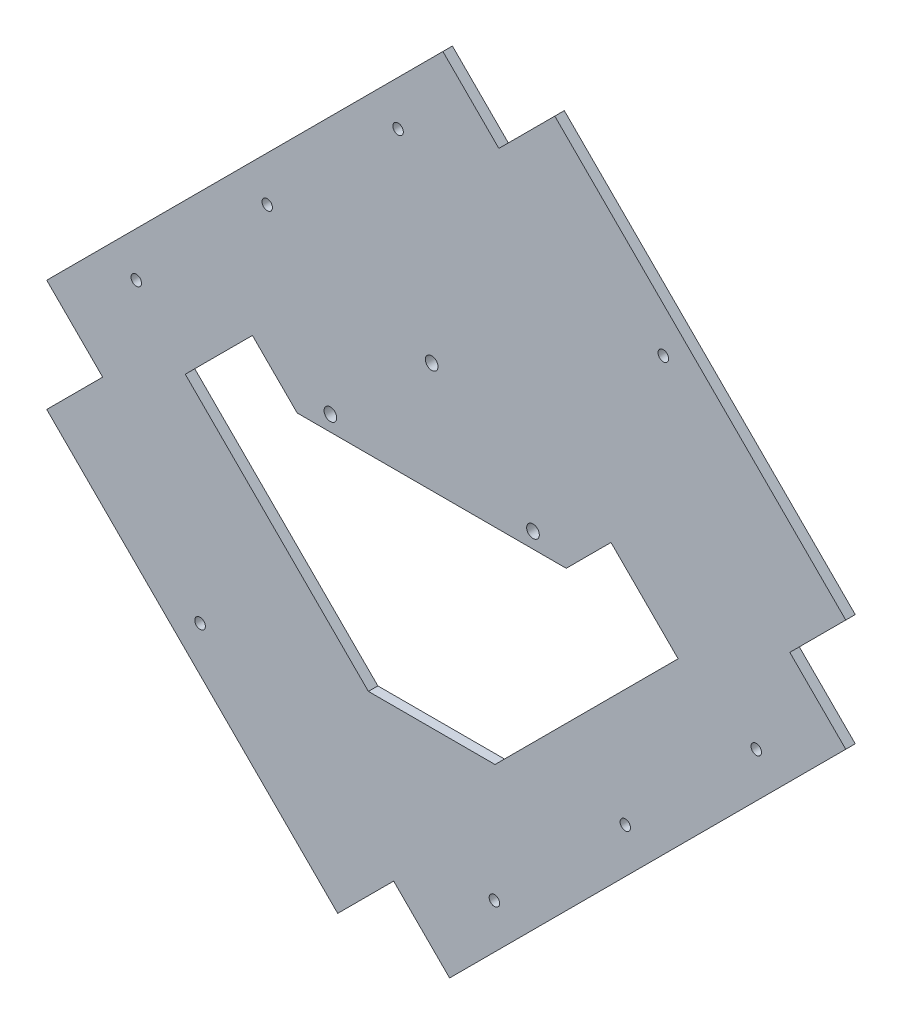
ISO-10303-21;
HEADER;
FILE_DESCRIPTION(('STEP AP214'),'2;1');
FILE_NAME('part.step','',(''),(''),'','','');
FILE_SCHEMA(('AUTOMOTIVE_DESIGN { 1 0 10303 214 1 1 1 1 }'));
ENDSEC;
DATA;
#1=APPLICATION_CONTEXT('core data for automotive mechanical design processes');
#2=APPLICATION_PROTOCOL_DEFINITION('international standard','automotive_design',2000,#1);
#3=PRODUCT_CONTEXT('',#1,'mechanical');
#4=PRODUCT('Part','Part','',(#3));
#5=PRODUCT_RELATED_PRODUCT_CATEGORY('part','',(#4));
#6=PRODUCT_DEFINITION_FORMATION('','',#4);
#7=PRODUCT_DEFINITION_CONTEXT('part definition',#1,'design');
#8=PRODUCT_DEFINITION('design','',#6,#7);
#9=PRODUCT_DEFINITION_SHAPE('','',#8);
#10=(LENGTH_UNIT() NAMED_UNIT(*) SI_UNIT(.MILLI.,.METRE.));
#11=(NAMED_UNIT(*) PLANE_ANGLE_UNIT() SI_UNIT($,.RADIAN.));
#12=(NAMED_UNIT(*) SI_UNIT($,.STERADIAN.) SOLID_ANGLE_UNIT());
#13=UNCERTAINTY_MEASURE_WITH_UNIT(LENGTH_MEASURE(1.E-05),#10,'distance_accuracy_value','');
#14=(GEOMETRIC_REPRESENTATION_CONTEXT(3) GLOBAL_UNCERTAINTY_ASSIGNED_CONTEXT((#13)) GLOBAL_UNIT_ASSIGNED_CONTEXT((#10,
#11,#12)) REPRESENTATION_CONTEXT('',''));
#15=CARTESIAN_POINT('',(0.,0.,0.));
#16=DIRECTION('',(0.,0.,1.));
#17=DIRECTION('',(1.,0.,0.));
#18=AXIS2_PLACEMENT_3D('',#15,#16,#17);
#19=CARTESIAN_POINT('',(-160.51323932996,65.2264068714516,-7.));
#20=DIRECTION('',(0.707106781186548,0.707106781186547,0.));
#21=DIRECTION('',(-0.707106781186547,0.707106781186548,0.));
#22=AXIS2_PLACEMENT_3D('',#19,#20,#21);
#23=PLANE('',#22);
#24=DIRECTION('',(0.707106781186547,-0.707106781186548,0.));
#25=VECTOR('',#24,1.);
#26=CARTESIAN_POINT('',(-47.6434162292543,-47.6434162292543,0.));
#27=LINE('',#26,#25);
#28=CARTESIAN_POINT('',(-121.6223663647,26.3355339061915,0.));
#29=VERTEX_POINT('',#28);
#30=CARTESIAN_POINT('',(-29.6984848104488,-65.5883476480598,0.));
#31=VERTEX_POINT('',#30);
#32=EDGE_CURVE('E328',#29,#31,#27,.T.);
#33=ORIENTED_EDGE('',*,*,#32,.T.);
#34=DIRECTION('',(0.,0.,-1.));
#35=VECTOR('',#34,1.);
#36=CARTESIAN_POINT('',(-29.6984848104488,-65.5883476480598,3.));
#37=LINE('',#36,#35);
#38=CARTESIAN_POINT('',(-29.6984848104488,-65.5883476480598,3.));
#39=VERTEX_POINT('',#38);
#40=EDGE_CURVE('E273',#39,#31,#37,.T.);
#41=ORIENTED_EDGE('',*,*,#40,.F.);
#42=DIRECTION('',(-0.707106781186547,0.707106781186548,0.));
#43=VECTOR('',#42,1.);
#44=CARTESIAN_POINT('',(-160.51323932996,65.2264068714516,3.));
#45=LINE('',#44,#43);
#46=CARTESIAN_POINT('',(-121.6223663647,26.3355339061915,3.));
#47=VERTEX_POINT('',#46);
#48=EDGE_CURVE('E325',#39,#47,#45,.T.);
#49=ORIENTED_EDGE('',*,*,#48,.T.);
#50=DIRECTION('',(0.,0.,-1.));
#51=VECTOR('',#50,1.);
#52=CARTESIAN_POINT('',(-121.6223663647,26.3355339061915,3.));
#53=LINE('',#52,#51);
#54=EDGE_CURVE('E304',#47,#29,#53,.T.);
#55=ORIENTED_EDGE('',*,*,#54,.T.);
#56=EDGE_LOOP('',(#33,#41,#49,#55));
#57=FACE_BOUND('',#56,.T.);
#58=ADVANCED_FACE('F82',(#57),#23,.F.);
#59=CARTESIAN_POINT('',(160.513239328732,65.2264068714516,-362.175614304609));
#60=DIRECTION('',(0.707106781186547,0.707106781186547,0.));
#61=DIRECTION('',(-0.707106781186548,0.707106781186548,0.));
#62=AXIS2_PLACEMENT_3D('',#59,#60,#61);
#63=PLANE('',#62);
#64=DIRECTION('',(-0.707106781186547,0.707106781186548,0.));
#65=VECTOR('',#64,1.);
#66=CARTESIAN_POINT('',(160.513239328732,65.2264068714516,3.));
#67=LINE('',#66,#65);
#68=CARTESIAN_POINT('',(130.814754518897,94.9248916812865,3.));
#69=VERTEX_POINT('',#68);
#70=CARTESIAN_POINT('',(38.8908729646462,186.848773235538,3.));
#71=VERTEX_POINT('',#70);
#72=EDGE_CURVE('E320',#69,#71,#67,.T.);
#73=ORIENTED_EDGE('',*,*,#72,.F.);
#74=DIRECTION('',(0.,0.,-1.));
#75=VECTOR('',#74,1.);
#76=CARTESIAN_POINT('',(130.814754518897,94.9248916812865,3.));
#77=LINE('',#76,#75);
#78=CARTESIAN_POINT('',(130.814754518897,94.9248916812865,0.));
#79=VERTEX_POINT('',#78);
#80=EDGE_CURVE('E224',#69,#79,#77,.T.);
#81=ORIENTED_EDGE('',*,*,#80,.T.);
#82=DIRECTION('',(-0.707106781186548,0.707106781186548,0.));
#83=VECTOR('',#82,1.);
#84=CARTESIAN_POINT('',(160.513239328732,65.2264068714516,0.));
#85=LINE('',#84,#83);
#86=CARTESIAN_POINT('',(38.8908729646462,186.848773235538,0.));
#87=VERTEX_POINT('',#86);
#88=EDGE_CURVE('E322',#79,#87,#85,.T.);
#89=ORIENTED_EDGE('',*,*,#88,.T.);
#90=DIRECTION('',(0.,0.,-1.));
#91=VECTOR('',#90,1.);
#92=CARTESIAN_POINT('',(38.8908729646462,186.848773235538,3.));
#93=LINE('',#92,#91);
#94=EDGE_CURVE('E301',#71,#87,#93,.T.);
#95=ORIENTED_EDGE('',*,*,#94,.F.);
#96=EDGE_LOOP('',(#73,#81,#89,#95));
#97=FACE_BOUND('',#96,.T.);
#98=ADVANCED_FACE('F441',(#97),#63,.T.);
#99=CARTESIAN_POINT('',(0.,0.,3.));
#100=DIRECTION('',(0.,0.,-1.));
#101=DIRECTION('',(-1.,0.,0.));
#102=AXIS2_PLACEMENT_3D('',#99,#100,#101);
#103=PLANE('',#102);
#104=CARTESIAN_POINT('',(-10.6066017184122,158.564501988076,3.));
#105=DIRECTION('',(0.,0.,-1.));
#106=DIRECTION('',(-1.,0.,0.));
#107=AXIS2_PLACEMENT_3D('',#104,#105,#106);
#108=CIRCLE('',#107,1.65000000000001);
#109=CARTESIAN_POINT('',(-12.2566017184123,158.564501988076,3.));
#110=VERTEX_POINT('',#109);
#111=EDGE_CURVE('E251',#110,#110,#108,.T.);
#112=ORIENTED_EDGE('',*,*,#111,.T.);
#113=EDGE_LOOP('',(#112));
#114=FACE_BOUND('',#113,.T.);
#115=CARTESIAN_POINT('',(-51.9723484178253,117.198755288663,3.));
#116=DIRECTION('',(0.,0.,-1.));
#117=DIRECTION('',(-1.,0.,0.));
#118=AXIS2_PLACEMENT_3D('',#115,#116,#117);
#119=CIRCLE('',#118,1.65);
#120=CARTESIAN_POINT('',(-53.6223484178253,117.198755288663,3.));
#121=VERTEX_POINT('',#120);
#122=EDGE_CURVE('E518',#121,#121,#119,.T.);
#123=ORIENTED_EDGE('',*,*,#122,.T.);
#124=EDGE_LOOP('',(#123));
#125=FACE_BOUND('',#124,.T.);
#126=CARTESIAN_POINT('',(-93.3380951172383,75.8330085892499,3.));
#127=DIRECTION('',(0.,0.,-1.));
#128=DIRECTION('',(-1.,0.,0.));
#129=AXIS2_PLACEMENT_3D('',#126,#127,#128);
#130=CIRCLE('',#129,1.65);
#131=CARTESIAN_POINT('',(-94.9880951172383,75.8330085892499,3.));
#132=VERTEX_POINT('',#131);
#133=EDGE_CURVE('E520',#132,#132,#130,.T.);
#134=ORIENTED_EDGE('',*,*,#133,.T.);
#135=EDGE_LOOP('',(#134));
#136=FACE_BOUND('',#135,.T.);
#137=CARTESIAN_POINT('',(102.530483271436,45.4274169982283,3.));
#138=DIRECTION('',(0.,0.,-1.));
#139=DIRECTION('',(-1.,0.,0.));
#140=AXIS2_PLACEMENT_3D('',#137,#138,#139);
#141=CIRCLE('',#140,1.65);
#142=CARTESIAN_POINT('',(100.880483271436,45.4274169982283,3.));
#143=VERTEX_POINT('',#142);
#144=EDGE_CURVE('E524',#143,#143,#141,.T.);
#145=ORIENTED_EDGE('',*,*,#144,.T.);
#146=EDGE_LOOP('',(#145));
#147=FACE_BOUND('',#146,.T.);
#148=CARTESIAN_POINT('',(61.1647365720224,4.06167029881523,3.));
#149=DIRECTION('',(0.,0.,-1.));
#150=DIRECTION('',(-1.,0.,0.));
#151=AXIS2_PLACEMENT_3D('',#148,#149,#150);
#152=CIRCLE('',#151,1.65);
#153=CARTESIAN_POINT('',(59.5147365720224,4.06167029881523,3.));
#154=VERTEX_POINT('',#153);
#155=EDGE_CURVE('E529',#154,#154,#152,.T.);
#156=ORIENTED_EDGE('',*,*,#155,.T.);
#157=EDGE_LOOP('',(#156));
#158=FACE_BOUND('',#157,.T.);
#159=CARTESIAN_POINT('',(19.7989898726094,-37.3040764005978,3.));
#160=DIRECTION('',(0.,0.,-1.));
#161=DIRECTION('',(-1.,0.,0.));
#162=AXIS2_PLACEMENT_3D('',#159,#160,#161);
#163=CIRCLE('',#162,1.65);
#164=CARTESIAN_POINT('',(18.1489898726094,-37.3040764005978,3.));
#165=VERTEX_POINT('',#164);
#166=EDGE_CURVE('E532',#165,#165,#163,.T.);
#167=ORIENTED_EDGE('',*,*,#166,.T.);
#168=EDGE_LOOP('',(#167));
#169=FACE_BOUND('',#168,.T.);
#170=CARTESIAN_POINT('',(73.1855518521937,138.411958724259,3.));
#171=DIRECTION('',(0.,0.,1.));
#172=DIRECTION('',(1.,0.,0.));
#173=AXIS2_PLACEMENT_3D('',#170,#171,#172);
#174=CIRCLE('',#173,1.675);
#175=CARTESIAN_POINT('',(74.8605518521937,138.411958724259,3.));
#176=VERTEX_POINT('',#175);
#177=EDGE_CURVE('E314',#176,#176,#174,.T.);
#178=ORIENTED_EDGE('',*,*,#177,.F.);
#179=EDGE_LOOP('',(#178));
#180=FACE_BOUND('',#179,.T.);
#181=CARTESIAN_POINT('',(-73.1855518534216,-7.95914498135607,3.));
#182=DIRECTION('',(0.,0.,1.));
#183=DIRECTION('',(1.,0.,0.));
#184=AXIS2_PLACEMENT_3D('',#181,#182,#183);
#185=CIRCLE('',#184,1.675);
#186=CARTESIAN_POINT('',(-71.5105518534216,-7.95914498135607,3.));
#187=VERTEX_POINT('',#186);
#188=EDGE_CURVE('E303',#187,#187,#185,.T.);
#189=ORIENTED_EDGE('',*,*,#188,.F.);
#190=EDGE_LOOP('',(#189));
#191=FACE_BOUND('',#190,.T.);
#192=ORIENTED_EDGE('',*,*,#48,.F.);
#193=DIRECTION('',(0.707106781186548,0.707106781186548,0.));
#194=VECTOR('',#193,1.);
#195=CARTESIAN_POINT('',(17.9449314188055,-17.9449314188055,3.));
#196=LINE('',#195,#194);
#197=CARTESIAN_POINT('',(-12.0208152807852,-47.9106781183961,3.));
#198=VERTEX_POINT('',#197);
#199=EDGE_CURVE('E229',#39,#198,#196,.T.);
#200=ORIENTED_EDGE('',*,*,#199,.T.);
#201=DIRECTION('',(0.707106781186549,-0.707106781186546,0.));
#202=VECTOR('',#201,1.);
#203=CARTESIAN_POINT('',(-29.9657466995906,-29.9657466995907,3.));
#204=LINE('',#203,#202);
#205=CARTESIAN_POINT('',(5.65685424887843,-65.5883476480597,3.));
#206=VERTEX_POINT('',#205);
#207=EDGE_CURVE('E256',#198,#206,#204,.T.);
#208=ORIENTED_EDGE('',*,*,#207,.T.);
#209=DIRECTION('',(-0.707106781186548,-0.707106781186547,0.));
#210=VECTOR('',#209,1.);
#211=CARTESIAN_POINT('',(35.622600948469,-35.6226009484691,3.));
#212=LINE('',#211,#210);
#213=CARTESIAN_POINT('',(130.814754518897,59.5695526219592,3.));
#214=VERTEX_POINT('',#213);
#215=EDGE_CURVE('E238',#214,#206,#212,.T.);
#216=ORIENTED_EDGE('',*,*,#215,.F.);
#217=DIRECTION('',(0.707106781186547,-0.707106781186548,0.));
#218=VECTOR('',#217,1.);
#219=CARTESIAN_POINT('',(95.1921535704283,95.1921535704282,3.));
#220=LINE('',#219,#218);
#221=CARTESIAN_POINT('',(113.137084989234,77.2472221516229,3.));
#222=VERTEX_POINT('',#221);
#223=EDGE_CURVE('E230',#222,#214,#220,.T.);
#224=ORIENTED_EDGE('',*,*,#223,.F.);
#225=DIRECTION('',(-0.707106781186548,-0.707106781186548,0.));
#226=VECTOR('',#225,1.);
#227=CARTESIAN_POINT('',(17.9449314188054,-17.9449314188054,3.));
#228=LINE('',#227,#226);
#229=EDGE_CURVE('E219',#69,#222,#228,.T.);
#230=ORIENTED_EDGE('',*,*,#229,.F.);
#231=ORIENTED_EDGE('',*,*,#72,.T.);
#232=DIRECTION('',(-0.70710678118655,-0.707106781186545,0.));
#233=VECTOR('',#232,1.);
#234=CARTESIAN_POINT('',(-73.9789501354459,73.9789501354464,3.));
#235=LINE('',#234,#233);
#236=CARTESIAN_POINT('',(21.2132034349825,169.171103705874,3.));
#237=VERTEX_POINT('',#236);
#238=EDGE_CURVE('E99',#71,#237,#235,.T.);
#239=ORIENTED_EDGE('',*,*,#238,.T.);
#240=DIRECTION('',(-0.707106781186548,0.707106781186548,0.));
#241=VECTOR('',#240,1.);
#242=CARTESIAN_POINT('',(95.1921535704283,95.1921535704283,3.));
#243=LINE('',#242,#241);
#244=CARTESIAN_POINT('',(3.53553390531877,186.848773235538,3.));
#245=VERTEX_POINT('',#244);
#246=EDGE_CURVE('E277',#237,#245,#243,.T.);
#247=ORIENTED_EDGE('',*,*,#246,.T.);
#248=DIRECTION('',(0.707106781186548,0.707106781186547,0.));
#249=VECTOR('',#248,1.);
#250=CARTESIAN_POINT('',(-91.6566196651095,91.6566196651096,3.));
#251=LINE('',#250,#249);
#252=CARTESIAN_POINT('',(-121.6223663647,61.690872965519,3.));
#253=VERTEX_POINT('',#252);
#254=EDGE_CURVE('E281',#253,#245,#251,.T.);
#255=ORIENTED_EDGE('',*,*,#254,.F.);
#256=DIRECTION('',(-0.707106781186547,0.707106781186548,0.));
#257=VECTOR('',#256,1.);
#258=CARTESIAN_POINT('',(-29.9657466995906,-29.9657466995906,3.));
#259=LINE('',#258,#257);
#260=CARTESIAN_POINT('',(-103.944696835036,44.0132034358552,3.));
#261=VERTEX_POINT('',#260);
#262=EDGE_CURVE('E283',#261,#253,#259,.T.);
#263=ORIENTED_EDGE('',*,*,#262,.F.);
#264=DIRECTION('',(0.707106781186546,0.707106781186549,0.));
#265=VECTOR('',#264,1.);
#266=CARTESIAN_POINT('',(-73.978950135446,73.9789501354456,3.));
#267=LINE('',#266,#265);
#268=EDGE_CURVE('E285',#47,#261,#267,.T.);
#269=ORIENTED_EDGE('',*,*,#268,.F.);
#270=EDGE_LOOP('',(#192,#200,#208,#216,#224,#230,#231,#239,#247,#255,#263,#269));
#271=FACE_BOUND('',#270,.T.);
#272=DIRECTION('',(0.707106781186548,-0.707106781186547,0.));
#273=VECTOR('',#272,1.);
#274=CARTESIAN_POINT('',(-77.8553390593274,57.8553390593274,3.));
#275=LINE('',#274,#273);
#276=CARTESIAN_POINT('',(-77.8553390593274,57.8553390593274,3.));
#277=VERTEX_POINT('',#276);
#278=CARTESIAN_POINT('',(-20.,0.,3.));
#279=VERTEX_POINT('',#278);
#280=EDGE_CURVE('E350',#277,#279,#275,.T.);
#281=ORIENTED_EDGE('',*,*,#280,.F.);
#282=DIRECTION('',(-0.707106781186547,-0.707106781186548,0.));
#283=VECTOR('',#282,1.);
#284=CARTESIAN_POINT('',(-56.642135623731,79.0685424949238,3.));
#285=LINE('',#284,#283);
#286=CARTESIAN_POINT('',(-56.642135623731,79.0685424949238,3.));
#287=VERTEX_POINT('',#286);
#288=EDGE_CURVE('E366',#287,#277,#285,.T.);
#289=ORIENTED_EDGE('',*,*,#288,.F.);
#290=DIRECTION('',(-0.707106781186548,0.707106781186547,0.));
#291=VECTOR('',#290,1.);
#292=CARTESIAN_POINT('',(-42.5,64.9264068711928,3.));
#293=LINE('',#292,#291);
#294=CARTESIAN_POINT('',(-42.5,64.9264068711928,3.));
#295=VERTEX_POINT('',#294);
#296=EDGE_CURVE('E363',#295,#287,#293,.T.);
#297=ORIENTED_EDGE('',*,*,#296,.F.);
#298=DIRECTION('',(-1.,0.,0.));
#299=VECTOR('',#298,1.);
#300=CARTESIAN_POINT('',(42.5,64.9264068711929,3.));
#301=LINE('',#300,#299);
#302=CARTESIAN_POINT('',(42.5,64.9264068711929,3.));
#303=VERTEX_POINT('',#302);
#304=EDGE_CURVE('E361',#303,#295,#301,.T.);
#305=ORIENTED_EDGE('',*,*,#304,.F.);
#306=DIRECTION('',(-0.707106781186548,-0.707106781186547,0.));
#307=VECTOR('',#306,1.);
#308=CARTESIAN_POINT('',(56.642135623731,79.0685424949238,3.));
#309=LINE('',#308,#307);
#310=CARTESIAN_POINT('',(56.642135623731,79.0685424949238,3.));
#311=VERTEX_POINT('',#310);
#312=EDGE_CURVE('E359',#311,#303,#309,.T.);
#313=ORIENTED_EDGE('',*,*,#312,.F.);
#314=DIRECTION('',(-0.707106781186547,0.707106781186548,0.));
#315=VECTOR('',#314,1.);
#316=CARTESIAN_POINT('',(77.8553390593274,57.8553390593274,3.));
#317=LINE('',#316,#315);
#318=CARTESIAN_POINT('',(77.8553390593274,57.8553390593274,3.));
#319=VERTEX_POINT('',#318);
#320=EDGE_CURVE('E357',#319,#311,#317,.T.);
#321=ORIENTED_EDGE('',*,*,#320,.F.);
#322=DIRECTION('',(0.707106781186547,0.707106781186548,0.));
#323=VECTOR('',#322,1.);
#324=CARTESIAN_POINT('',(20.,0.,3.));
#325=LINE('',#324,#323);
#326=CARTESIAN_POINT('',(20.,0.,3.));
#327=VERTEX_POINT('',#326);
#328=EDGE_CURVE('E355',#327,#319,#325,.T.);
#329=ORIENTED_EDGE('',*,*,#328,.F.);
#330=DIRECTION('',(1.,0.,0.));
#331=VECTOR('',#330,1.);
#332=CARTESIAN_POINT('',(-20.,0.,3.));
#333=LINE('',#332,#331);
#334=EDGE_CURVE('E352',#279,#327,#333,.T.);
#335=ORIENTED_EDGE('',*,*,#334,.F.);
#336=EDGE_LOOP('',(#281,#289,#297,#305,#313,#321,#329,#335));
#337=FACE_BOUND('',#336,.T.);
#338=CARTESIAN_POINT('',(32.,69.8264068711928,3.));
#339=DIRECTION('',(0.,0.,1.));
#340=DIRECTION('',(1.,0.,0.));
#341=AXIS2_PLACEMENT_3D('',#338,#339,#340);
#342=CIRCLE('',#341,2.);
#343=CARTESIAN_POINT('',(34.,69.8264068711928,3.));
#344=VERTEX_POINT('',#343);
#345=EDGE_CURVE('E344',#344,#344,#342,.T.);
#346=ORIENTED_EDGE('',*,*,#345,.F.);
#347=EDGE_LOOP('',(#346));
#348=FACE_BOUND('',#347,.T.);
#349=CARTESIAN_POINT('',(-32.,69.8264068711928,3.));
#350=DIRECTION('',(0.,0.,1.));
#351=DIRECTION('',(1.,0.,0.));
#352=AXIS2_PLACEMENT_3D('',#349,#350,#351);
#353=CIRCLE('',#352,2.);
#354=CARTESIAN_POINT('',(-30.,69.8264068711928,3.));
#355=VERTEX_POINT('',#354);
#356=EDGE_CURVE('E338',#355,#355,#353,.T.);
#357=ORIENTED_EDGE('',*,*,#356,.F.);
#358=EDGE_LOOP('',(#357));
#359=FACE_BOUND('',#358,.T.);
#360=CARTESIAN_POINT('',(0.,99.8264068711928,3.));
#361=DIRECTION('',(0.,0.,1.));
#362=DIRECTION('',(1.,0.,0.));
#363=AXIS2_PLACEMENT_3D('',#360,#361,#362);
#364=CIRCLE('',#363,2.);
#365=CARTESIAN_POINT('',(2.,99.8264068711928,3.));
#366=VERTEX_POINT('',#365);
#367=EDGE_CURVE('E332',#366,#366,#364,.T.);
#368=ORIENTED_EDGE('',*,*,#367,.F.);
#369=EDGE_LOOP('',(#368));
#370=FACE_BOUND('',#369,.T.);
#371=ADVANCED_FACE('F242',(#114,#125,#136,#147,#158,#169,#180,#191,#271,#337,#348,#359,#370),
#103,.F.);
#372=CARTESIAN_POINT('',(0.,0.,0.));
#373=DIRECTION('',(0.,0.,-1.));
#374=DIRECTION('',(-1.,0.,0.));
#375=AXIS2_PLACEMENT_3D('',#372,#373,#374);
#376=PLANE('',#375);
#377=CARTESIAN_POINT('',(-10.6066017184122,158.564501988076,0.));
#378=DIRECTION('',(0.,0.,-1.));
#379=DIRECTION('',(-1.,0.,0.));
#380=AXIS2_PLACEMENT_3D('',#377,#378,#379);
#381=CIRCLE('',#380,1.65000000000001);
#382=CARTESIAN_POINT('',(-12.2566017184123,158.564501988076,0.));
#383=VERTEX_POINT('',#382);
#384=EDGE_CURVE('E514',#383,#383,#381,.T.);
#385=ORIENTED_EDGE('',*,*,#384,.F.);
#386=EDGE_LOOP('',(#385));
#387=FACE_BOUND('',#386,.T.);
#388=CARTESIAN_POINT('',(-51.9723484178253,117.198755288663,0.));
#389=DIRECTION('',(0.,0.,-1.));
#390=DIRECTION('',(-1.,0.,0.));
#391=AXIS2_PLACEMENT_3D('',#388,#389,#390);
#392=CIRCLE('',#391,1.65);
#393=CARTESIAN_POINT('',(-53.6223484178253,117.198755288663,0.));
#394=VERTEX_POINT('',#393);
#395=EDGE_CURVE('E547',#394,#394,#392,.T.);
#396=ORIENTED_EDGE('',*,*,#395,.F.);
#397=EDGE_LOOP('',(#396));
#398=FACE_BOUND('',#397,.T.);
#399=CARTESIAN_POINT('',(-93.3380951172383,75.8330085892499,0.));
#400=DIRECTION('',(0.,0.,-1.));
#401=DIRECTION('',(-1.,0.,0.));
#402=AXIS2_PLACEMENT_3D('',#399,#400,#401);
#403=CIRCLE('',#402,1.65);
#404=CARTESIAN_POINT('',(-94.9880951172383,75.8330085892499,0.));
#405=VERTEX_POINT('',#404);
#406=EDGE_CURVE('E544',#405,#405,#403,.T.);
#407=ORIENTED_EDGE('',*,*,#406,.F.);
#408=EDGE_LOOP('',(#407));
#409=FACE_BOUND('',#408,.T.);
#410=CARTESIAN_POINT('',(102.530483271436,45.4274169982283,0.));
#411=DIRECTION('',(0.,0.,-1.));
#412=DIRECTION('',(-1.,0.,0.));
#413=AXIS2_PLACEMENT_3D('',#410,#411,#412);
#414=CIRCLE('',#413,1.65);
#415=CARTESIAN_POINT('',(100.880483271436,45.4274169982283,0.));
#416=VERTEX_POINT('',#415);
#417=EDGE_CURVE('E541',#416,#416,#414,.T.);
#418=ORIENTED_EDGE('',*,*,#417,.F.);
#419=EDGE_LOOP('',(#418));
#420=FACE_BOUND('',#419,.T.);
#421=CARTESIAN_POINT('',(61.1647365720224,4.06167029881523,0.));
#422=DIRECTION('',(0.,0.,-1.));
#423=DIRECTION('',(-1.,0.,0.));
#424=AXIS2_PLACEMENT_3D('',#421,#422,#423);
#425=CIRCLE('',#424,1.65);
#426=CARTESIAN_POINT('',(59.5147365720224,4.06167029881523,0.));
#427=VERTEX_POINT('',#426);
#428=EDGE_CURVE('E538',#427,#427,#425,.T.);
#429=ORIENTED_EDGE('',*,*,#428,.F.);
#430=EDGE_LOOP('',(#429));
#431=FACE_BOUND('',#430,.T.);
#432=CARTESIAN_POINT('',(19.7989898726094,-37.3040764005978,0.));
#433=DIRECTION('',(0.,0.,-1.));
#434=DIRECTION('',(-1.,0.,0.));
#435=AXIS2_PLACEMENT_3D('',#432,#433,#434);
#436=CIRCLE('',#435,1.65);
#437=CARTESIAN_POINT('',(18.1489898726094,-37.3040764005978,0.));
#438=VERTEX_POINT('',#437);
#439=EDGE_CURVE('E535',#438,#438,#436,.T.);
#440=ORIENTED_EDGE('',*,*,#439,.F.);
#441=EDGE_LOOP('',(#440));
#442=FACE_BOUND('',#441,.T.);
#443=DIRECTION('',(0.707106781186548,0.707106781186548,0.));
#444=VECTOR('',#443,1.);
#445=CARTESIAN_POINT('',(17.9449314188055,-17.9449314188055,0.));
#446=LINE('',#445,#444);
#447=CARTESIAN_POINT('',(-12.0208152807852,-47.9106781183961,0.));
#448=VERTEX_POINT('',#447);
#449=EDGE_CURVE('E261',#31,#448,#446,.T.);
#450=ORIENTED_EDGE('',*,*,#449,.F.);
#451=ORIENTED_EDGE('',*,*,#32,.F.);
#452=DIRECTION('',(0.707106781186546,0.707106781186549,0.));
#453=VECTOR('',#452,1.);
#454=CARTESIAN_POINT('',(-73.978950135446,73.9789501354456,0.));
#455=LINE('',#454,#453);
#456=CARTESIAN_POINT('',(-103.944696835036,44.0132034358552,0.));
#457=VERTEX_POINT('',#456);
#458=EDGE_CURVE('E278',#29,#457,#455,.T.);
#459=ORIENTED_EDGE('',*,*,#458,.T.);
#460=DIRECTION('',(-0.707106781186547,0.707106781186548,0.));
#461=VECTOR('',#460,1.);
#462=CARTESIAN_POINT('',(-29.9657466995906,-29.9657466995906,0.));
#463=LINE('',#462,#461);
#464=CARTESIAN_POINT('',(-121.6223663647,61.690872965519,0.));
#465=VERTEX_POINT('',#464);
#466=EDGE_CURVE('E296',#457,#465,#463,.T.);
#467=ORIENTED_EDGE('',*,*,#466,.T.);
#468=DIRECTION('',(0.707106781186548,0.707106781186547,0.));
#469=VECTOR('',#468,1.);
#470=CARTESIAN_POINT('',(-91.6566196651095,91.6566196651096,0.));
#471=LINE('',#470,#469);
#472=CARTESIAN_POINT('',(3.53553390531877,186.848773235538,0.));
#473=VERTEX_POINT('',#472);
#474=EDGE_CURVE('E293',#465,#473,#471,.T.);
#475=ORIENTED_EDGE('',*,*,#474,.T.);
#476=DIRECTION('',(-0.707106781186548,0.707106781186548,0.));
#477=VECTOR('',#476,1.);
#478=CARTESIAN_POINT('',(95.1921535704283,95.1921535704283,0.));
#479=LINE('',#478,#477);
#480=CARTESIAN_POINT('',(21.2132034349825,169.171103705874,0.));
#481=VERTEX_POINT('',#480);
#482=EDGE_CURVE('E290',#481,#473,#479,.T.);
#483=ORIENTED_EDGE('',*,*,#482,.F.);
#484=DIRECTION('',(-0.70710678118655,-0.707106781186545,0.));
#485=VECTOR('',#484,1.);
#486=CARTESIAN_POINT('',(-73.9789501354459,73.9789501354464,0.));
#487=LINE('',#486,#485);
#488=EDGE_CURVE('E268',#87,#481,#487,.T.);
#489=ORIENTED_EDGE('',*,*,#488,.F.);
#490=ORIENTED_EDGE('',*,*,#88,.F.);
#491=DIRECTION('',(-0.707106781186548,-0.707106781186548,0.));
#492=VECTOR('',#491,1.);
#493=CARTESIAN_POINT('',(17.9449314188054,-17.9449314188054,0.));
#494=LINE('',#493,#492);
#495=CARTESIAN_POINT('',(113.137084989234,77.2472221516229,0.));
#496=VERTEX_POINT('',#495);
#497=EDGE_CURVE('E107',#79,#496,#494,.T.);
#498=ORIENTED_EDGE('',*,*,#497,.T.);
#499=DIRECTION('',(0.707106781186547,-0.707106781186548,0.));
#500=VECTOR('',#499,1.);
#501=CARTESIAN_POINT('',(95.1921535704283,95.1921535704282,0.));
#502=LINE('',#501,#500);
#503=CARTESIAN_POINT('',(130.814754518897,59.5695526219592,0.));
#504=VERTEX_POINT('',#503);
#505=EDGE_CURVE('E237',#496,#504,#502,.T.);
#506=ORIENTED_EDGE('',*,*,#505,.T.);
#507=DIRECTION('',(-0.707106781186548,-0.707106781186547,0.));
#508=VECTOR('',#507,1.);
#509=CARTESIAN_POINT('',(35.622600948469,-35.6226009484691,0.));
#510=LINE('',#509,#508);
#511=CARTESIAN_POINT('',(5.65685424887843,-65.5883476480597,0.));
#512=VERTEX_POINT('',#511);
#513=EDGE_CURVE('E245',#504,#512,#510,.T.);
#514=ORIENTED_EDGE('',*,*,#513,.T.);
#515=DIRECTION('',(0.707106781186549,-0.707106781186546,0.));
#516=VECTOR('',#515,1.);
#517=CARTESIAN_POINT('',(-29.9657466995906,-29.9657466995907,0.));
#518=LINE('',#517,#516);
#519=EDGE_CURVE('E248',#448,#512,#518,.T.);
#520=ORIENTED_EDGE('',*,*,#519,.F.);
#521=EDGE_LOOP('',(#450,#451,#459,#467,#475,#483,#489,#490,#498,#506,#514,#520));
#522=FACE_BOUND('',#521,.T.);
#523=CARTESIAN_POINT('',(73.1855518521937,138.411958724259,0.));
#524=DIRECTION('',(0.,0.,-1.));
#525=DIRECTION('',(-1.,0.,0.));
#526=AXIS2_PLACEMENT_3D('',#523,#524,#525);
#527=CIRCLE('',#526,1.675);
#528=CARTESIAN_POINT('',(71.5105518521937,138.411958724259,0.));
#529=VERTEX_POINT('',#528);
#530=EDGE_CURVE('E86',#529,#529,#527,.T.);
#531=ORIENTED_EDGE('',*,*,#530,.F.);
#532=EDGE_LOOP('',(#531));
#533=FACE_BOUND('',#532,.T.);
#534=CARTESIAN_POINT('',(-73.1855518534216,-7.95914498135607,0.));
#535=DIRECTION('',(0.,0.,-1.));
#536=DIRECTION('',(-1.,0.,0.));
#537=AXIS2_PLACEMENT_3D('',#534,#535,#536);
#538=CIRCLE('',#537,1.675);
#539=CARTESIAN_POINT('',(-74.8605518534216,-7.95914498135607,0.));
#540=VERTEX_POINT('',#539);
#541=EDGE_CURVE('E317',#540,#540,#538,.T.);
#542=ORIENTED_EDGE('',*,*,#541,.F.);
#543=EDGE_LOOP('',(#542));
#544=FACE_BOUND('',#543,.T.);
#545=CARTESIAN_POINT('',(-32.,69.8264068711928,0.));
#546=DIRECTION('',(0.,0.,1.));
#547=DIRECTION('',(1.,0.,0.));
#548=AXIS2_PLACEMENT_3D('',#545,#546,#547);
#549=CIRCLE('',#548,2.);
#550=CARTESIAN_POINT('',(-30.,69.8264068711928,0.));
#551=VERTEX_POINT('',#550);
#552=EDGE_CURVE('E335',#551,#551,#549,.T.);
#553=ORIENTED_EDGE('',*,*,#552,.T.);
#554=EDGE_LOOP('',(#553));
#555=FACE_BOUND('',#554,.T.);
#556=DIRECTION('',(-0.707106781186547,-0.707106781186548,0.));
#557=VECTOR('',#556,1.);
#558=CARTESIAN_POINT('',(-56.642135623731,79.0685424949238,0.));
#559=LINE('',#558,#557);
#560=CARTESIAN_POINT('',(-56.642135623731,79.0685424949238,0.));
#561=VERTEX_POINT('',#560);
#562=CARTESIAN_POINT('',(-77.8553390593274,57.8553390593274,0.));
#563=VERTEX_POINT('',#562);
#564=EDGE_CURVE('E353',#561,#563,#559,.T.);
#565=ORIENTED_EDGE('',*,*,#564,.T.);
#566=DIRECTION('',(0.707106781186548,-0.707106781186547,0.));
#567=VECTOR('',#566,1.);
#568=CARTESIAN_POINT('',(-77.8553390593274,57.8553390593274,0.));
#569=LINE('',#568,#567);
#570=CARTESIAN_POINT('',(-20.,0.,0.));
#571=VERTEX_POINT('',#570);
#572=EDGE_CURVE('E347',#563,#571,#569,.T.);
#573=ORIENTED_EDGE('',*,*,#572,.T.);
#574=DIRECTION('',(1.,0.,0.));
#575=VECTOR('',#574,1.);
#576=CARTESIAN_POINT('',(-20.,0.,0.));
#577=LINE('',#576,#575);
#578=CARTESIAN_POINT('',(20.,0.,0.));
#579=VERTEX_POINT('',#578);
#580=EDGE_CURVE('E371',#571,#579,#577,.T.);
#581=ORIENTED_EDGE('',*,*,#580,.T.);
#582=DIRECTION('',(0.707106781186547,0.707106781186548,0.));
#583=VECTOR('',#582,1.);
#584=CARTESIAN_POINT('',(20.,0.,0.));
#585=LINE('',#584,#583);
#586=CARTESIAN_POINT('',(77.8553390593274,57.8553390593274,0.));
#587=VERTEX_POINT('',#586);
#588=EDGE_CURVE('E374',#579,#587,#585,.T.);
#589=ORIENTED_EDGE('',*,*,#588,.T.);
#590=DIRECTION('',(-0.707106781186547,0.707106781186548,0.));
#591=VECTOR('',#590,1.);
#592=CARTESIAN_POINT('',(77.8553390593274,57.8553390593274,0.));
#593=LINE('',#592,#591);
#594=CARTESIAN_POINT('',(56.642135623731,79.0685424949238,0.));
#595=VERTEX_POINT('',#594);
#596=EDGE_CURVE('E377',#587,#595,#593,.T.);
#597=ORIENTED_EDGE('',*,*,#596,.T.);
#598=DIRECTION('',(-0.707106781186548,-0.707106781186547,0.));
#599=VECTOR('',#598,1.);
#600=CARTESIAN_POINT('',(56.642135623731,79.0685424949238,0.));
#601=LINE('',#600,#599);
#602=CARTESIAN_POINT('',(42.5,64.9264068711929,0.));
#603=VERTEX_POINT('',#602);
#604=EDGE_CURVE('E380',#595,#603,#601,.T.);
#605=ORIENTED_EDGE('',*,*,#604,.T.);
#606=DIRECTION('',(-1.,0.,0.));
#607=VECTOR('',#606,1.);
#608=CARTESIAN_POINT('',(42.5,64.9264068711929,0.));
#609=LINE('',#608,#607);
#610=CARTESIAN_POINT('',(-42.5,64.9264068711928,0.));
#611=VERTEX_POINT('',#610);
#612=EDGE_CURVE('E383',#603,#611,#609,.T.);
#613=ORIENTED_EDGE('',*,*,#612,.T.);
#614=DIRECTION('',(-0.707106781186548,0.707106781186547,0.));
#615=VECTOR('',#614,1.);
#616=CARTESIAN_POINT('',(-42.5,64.9264068711928,0.));
#617=LINE('',#616,#615);
#618=EDGE_CURVE('E386',#611,#561,#617,.T.);
#619=ORIENTED_EDGE('',*,*,#618,.T.);
#620=EDGE_LOOP('',(#565,#573,#581,#589,#597,#605,#613,#619));
#621=FACE_BOUND('',#620,.T.);
#622=CARTESIAN_POINT('',(32.,69.8264068711928,0.));
#623=DIRECTION('',(0.,0.,1.));
#624=DIRECTION('',(1.,0.,0.));
#625=AXIS2_PLACEMENT_3D('',#622,#623,#624);
#626=CIRCLE('',#625,2.);
#627=CARTESIAN_POINT('',(34.,69.8264068711928,0.));
#628=VERTEX_POINT('',#627);
#629=EDGE_CURVE('E341',#628,#628,#626,.T.);
#630=ORIENTED_EDGE('',*,*,#629,.T.);
#631=EDGE_LOOP('',(#630));
#632=FACE_BOUND('',#631,.T.);
#633=CARTESIAN_POINT('',(0.,99.8264068711928,0.));
#634=DIRECTION('',(0.,0.,1.));
#635=DIRECTION('',(1.,0.,0.));
#636=AXIS2_PLACEMENT_3D('',#633,#634,#635);
#637=CIRCLE('',#636,2.);
#638=CARTESIAN_POINT('',(2.,99.8264068711928,0.));
#639=VERTEX_POINT('',#638);
#640=EDGE_CURVE('E331',#639,#639,#637,.T.);
#641=ORIENTED_EDGE('',*,*,#640,.T.);
#642=EDGE_LOOP('',(#641));
#643=FACE_BOUND('',#642,.T.);
#644=ADVANCED_FACE('F84',(#387,#398,#409,#420,#431,#442,#522,#533,#544,#555,#621,#632,#643),
#376,.T.);
#645=CARTESIAN_POINT('',(-77.8553390593274,57.8553390593274,3.));
#646=DIRECTION('',(0.707106781186547,0.707106781186548,0.));
#647=DIRECTION('',(-0.707106781186548,0.707106781186547,0.));
#648=AXIS2_PLACEMENT_3D('',#645,#646,#647);
#649=PLANE('',#648);
#650=ORIENTED_EDGE('',*,*,#572,.F.);
#651=DIRECTION('',(0.,0.,-1.));
#652=VECTOR('',#651,1.);
#653=CARTESIAN_POINT('',(-77.8553390593274,57.8553390593274,3.));
#654=LINE('',#653,#652);
#655=EDGE_CURVE('E368',#277,#563,#654,.T.);
#656=ORIENTED_EDGE('',*,*,#655,.F.);
#657=ORIENTED_EDGE('',*,*,#280,.T.);
#658=DIRECTION('',(0.,0.,-1.));
#659=VECTOR('',#658,1.);
#660=CARTESIAN_POINT('',(-20.,0.,3.));
#661=LINE('',#660,#659);
#662=EDGE_CURVE('E12',#279,#571,#661,.T.);
#663=ORIENTED_EDGE('',*,*,#662,.T.);
#664=EDGE_LOOP('',(#650,#656,#657,#663));
#665=FACE_BOUND('',#664,.T.);
#666=ADVANCED_FACE('F414',(#665),#649,.T.);
#667=CARTESIAN_POINT('',(-20.,0.,3.));
#668=DIRECTION('',(0.,1.,0.));
#669=DIRECTION('',(-1.,0.,0.));
#670=AXIS2_PLACEMENT_3D('',#667,#668,#669);
#671=PLANE('',#670);
#672=ORIENTED_EDGE('',*,*,#580,.F.);
#673=ORIENTED_EDGE('',*,*,#662,.F.);
#674=ORIENTED_EDGE('',*,*,#334,.T.);
#675=DIRECTION('',(0.,0.,-1.));
#676=VECTOR('',#675,1.);
#677=CARTESIAN_POINT('',(20.,0.,3.));
#678=LINE('',#677,#676);
#679=EDGE_CURVE('E91',#327,#579,#678,.T.);
#680=ORIENTED_EDGE('',*,*,#679,.T.);
#681=EDGE_LOOP('',(#672,#673,#674,#680));
#682=FACE_BOUND('',#681,.T.);
#683=ADVANCED_FACE('F594',(#682),#671,.T.);
#684=CARTESIAN_POINT('',(20.,0.,3.));
#685=DIRECTION('',(-0.707106781186548,0.707106781186547,0.));
#686=DIRECTION('',(-0.707106781186547,-0.707106781186548,0.));
#687=AXIS2_PLACEMENT_3D('',#684,#685,#686);
#688=PLANE('',#687);
#689=ORIENTED_EDGE('',*,*,#588,.F.);
#690=ORIENTED_EDGE('',*,*,#679,.F.);
#691=ORIENTED_EDGE('',*,*,#328,.T.);
#692=DIRECTION('',(0.,0.,-1.));
#693=VECTOR('',#692,1.);
#694=CARTESIAN_POINT('',(77.8553390593274,57.8553390593274,3.));
#695=LINE('',#694,#693);
#696=EDGE_CURVE('E401',#319,#587,#695,.T.);
#697=ORIENTED_EDGE('',*,*,#696,.T.);
#698=EDGE_LOOP('',(#689,#690,#691,#697));
#699=FACE_BOUND('',#698,.T.);
#700=ADVANCED_FACE('F598',(#699),#688,.T.);
#701=CARTESIAN_POINT('',(77.8553390593274,57.8553390593274,3.));
#702=DIRECTION('',(-0.707106781186548,-0.707106781186547,0.));
#703=DIRECTION('',(0.707106781186547,-0.707106781186548,0.));
#704=AXIS2_PLACEMENT_3D('',#701,#702,#703);
#705=PLANE('',#704);
#706=ORIENTED_EDGE('',*,*,#596,.F.);
#707=ORIENTED_EDGE('',*,*,#696,.F.);
#708=ORIENTED_EDGE('',*,*,#320,.T.);
#709=DIRECTION('',(0.,0.,-1.));
#710=VECTOR('',#709,1.);
#711=CARTESIAN_POINT('',(56.642135623731,79.0685424949238,3.));
#712=LINE('',#711,#710);
#713=EDGE_CURVE('E399',#311,#595,#712,.T.);
#714=ORIENTED_EDGE('',*,*,#713,.T.);
#715=EDGE_LOOP('',(#706,#707,#708,#714));
#716=FACE_BOUND('',#715,.T.);
#717=ADVANCED_FACE('F602',(#716),#705,.T.);
#718=CARTESIAN_POINT('',(56.642135623731,79.0685424949238,3.));
#719=DIRECTION('',(0.707106781186547,-0.707106781186548,0.));
#720=DIRECTION('',(0.707106781186548,0.707106781186547,0.));
#721=AXIS2_PLACEMENT_3D('',#718,#719,#720);
#722=PLANE('',#721);
#723=ORIENTED_EDGE('',*,*,#604,.F.);
#724=ORIENTED_EDGE('',*,*,#713,.F.);
#725=ORIENTED_EDGE('',*,*,#312,.T.);
#726=DIRECTION('',(0.,0.,-1.));
#727=VECTOR('',#726,1.);
#728=CARTESIAN_POINT('',(42.5,64.9264068711929,3.));
#729=LINE('',#728,#727);
#730=EDGE_CURVE('E397',#303,#603,#729,.T.);
#731=ORIENTED_EDGE('',*,*,#730,.T.);
#732=EDGE_LOOP('',(#723,#724,#725,#731));
#733=FACE_BOUND('',#732,.T.);
#734=ADVANCED_FACE('F606',(#733),#722,.T.);
#735=CARTESIAN_POINT('',(42.5,64.9264068711929,3.));
#736=DIRECTION('',(0.,-1.,0.));
#737=DIRECTION('',(1.,0.,0.));
#738=AXIS2_PLACEMENT_3D('',#735,#736,#737);
#739=PLANE('',#738);
#740=ORIENTED_EDGE('',*,*,#612,.F.);
#741=ORIENTED_EDGE('',*,*,#730,.F.);
#742=ORIENTED_EDGE('',*,*,#304,.T.);
#743=DIRECTION('',(0.,0.,-1.));
#744=VECTOR('',#743,1.);
#745=CARTESIAN_POINT('',(-42.5,64.9264068711928,3.));
#746=LINE('',#745,#744);
#747=EDGE_CURVE('E395',#295,#611,#746,.T.);
#748=ORIENTED_EDGE('',*,*,#747,.T.);
#749=EDGE_LOOP('',(#740,#741,#742,#748));
#750=FACE_BOUND('',#749,.T.);
#751=ADVANCED_FACE('F610',(#750),#739,.T.);
#752=CARTESIAN_POINT('',(-42.5,64.9264068711928,3.));
#753=DIRECTION('',(-0.707106781186547,-0.707106781186548,0.));
#754=DIRECTION('',(0.707106781186548,-0.707106781186547,0.));
#755=AXIS2_PLACEMENT_3D('',#752,#753,#754);
#756=PLANE('',#755);
#757=ORIENTED_EDGE('',*,*,#618,.F.);
#758=ORIENTED_EDGE('',*,*,#747,.F.);
#759=ORIENTED_EDGE('',*,*,#296,.T.);
#760=DIRECTION('',(0.,0.,-1.));
#761=VECTOR('',#760,1.);
#762=CARTESIAN_POINT('',(-56.642135623731,79.0685424949238,3.));
#763=LINE('',#762,#761);
#764=EDGE_CURVE('E393',#287,#561,#763,.T.);
#765=ORIENTED_EDGE('',*,*,#764,.T.);
#766=EDGE_LOOP('',(#757,#758,#759,#765));
#767=FACE_BOUND('',#766,.T.);
#768=ADVANCED_FACE('F614',(#767),#756,.T.);
#769=CARTESIAN_POINT('',(-56.642135623731,79.0685424949238,3.));
#770=DIRECTION('',(0.707106781186548,-0.707106781186547,0.));
#771=DIRECTION('',(0.707106781186547,0.707106781186548,0.));
#772=AXIS2_PLACEMENT_3D('',#769,#770,#771);
#773=PLANE('',#772);
#774=ORIENTED_EDGE('',*,*,#564,.F.);
#775=ORIENTED_EDGE('',*,*,#764,.F.);
#776=ORIENTED_EDGE('',*,*,#288,.T.);
#777=ORIENTED_EDGE('',*,*,#655,.T.);
#778=EDGE_LOOP('',(#774,#775,#776,#777));
#779=FACE_BOUND('',#778,.T.);
#780=ADVANCED_FACE('F618',(#779),#773,.T.);
#781=CARTESIAN_POINT('',(32.,69.8264068711928,3.));
#782=DIRECTION('',(0.,0.,-1.));
#783=DIRECTION('',(-1.,0.,0.));
#784=AXIS2_PLACEMENT_3D('',#781,#782,#783);
#785=CYLINDRICAL_SURFACE('',#784,2.);
#786=ORIENTED_EDGE('',*,*,#345,.T.);
#787=EDGE_LOOP('',(#786));
#788=FACE_BOUND('',#787,.T.);
#789=ORIENTED_EDGE('',*,*,#629,.F.);
#790=EDGE_LOOP('',(#789));
#791=FACE_BOUND('',#790,.T.);
#792=ADVANCED_FACE('F436',(#788,#791),#785,.F.);
#793=CARTESIAN_POINT('',(-32.,69.8264068711928,3.));
#794=DIRECTION('',(0.,0.,-1.));
#795=DIRECTION('',(-1.,0.,0.));
#796=AXIS2_PLACEMENT_3D('',#793,#794,#795);
#797=CYLINDRICAL_SURFACE('',#796,2.);
#798=ORIENTED_EDGE('',*,*,#356,.T.);
#799=EDGE_LOOP('',(#798));
#800=FACE_BOUND('',#799,.T.);
#801=ORIENTED_EDGE('',*,*,#552,.F.);
#802=EDGE_LOOP('',(#801));
#803=FACE_BOUND('',#802,.T.);
#804=ADVANCED_FACE('F428',(#800,#803),#797,.F.);
#805=CARTESIAN_POINT('',(0.,99.8264068711928,3.));
#806=DIRECTION('',(0.,0.,-1.));
#807=DIRECTION('',(-1.,0.,0.));
#808=AXIS2_PLACEMENT_3D('',#805,#806,#807);
#809=CYLINDRICAL_SURFACE('',#808,2.);
#810=ORIENTED_EDGE('',*,*,#367,.T.);
#811=EDGE_LOOP('',(#810));
#812=FACE_BOUND('',#811,.T.);
#813=ORIENTED_EDGE('',*,*,#640,.F.);
#814=EDGE_LOOP('',(#813));
#815=FACE_BOUND('',#814,.T.);
#816=ADVANCED_FACE('F425',(#812,#815),#809,.F.);
#817=CARTESIAN_POINT('',(-73.1855518534216,-7.95914498135607,-82.));
#818=DIRECTION('',(0.,0.,1.));
#819=DIRECTION('',(1.,0.,0.));
#820=AXIS2_PLACEMENT_3D('',#817,#818,#819);
#821=CYLINDRICAL_SURFACE('',#820,1.675);
#822=ORIENTED_EDGE('',*,*,#541,.T.);
#823=EDGE_LOOP('',(#822));
#824=FACE_BOUND('',#823,.T.);
#825=ORIENTED_EDGE('',*,*,#188,.T.);
#826=EDGE_LOOP('',(#825));
#827=FACE_BOUND('',#826,.T.);
#828=ADVANCED_FACE('F427',(#824,#827),#821,.F.);
#829=CARTESIAN_POINT('',(73.1855518521937,138.411958724259,-82.));
#830=DIRECTION('',(0.,0.,1.));
#831=DIRECTION('',(1.,0.,0.));
#832=AXIS2_PLACEMENT_3D('',#829,#830,#831);
#833=CYLINDRICAL_SURFACE('',#832,1.675);
#834=ORIENTED_EDGE('',*,*,#530,.T.);
#835=EDGE_LOOP('',(#834));
#836=FACE_BOUND('',#835,.T.);
#837=ORIENTED_EDGE('',*,*,#177,.T.);
#838=EDGE_LOOP('',(#837));
#839=FACE_BOUND('',#838,.T.);
#840=ADVANCED_FACE('F409',(#836,#839),#833,.F.);
#841=CARTESIAN_POINT('',(-73.9789501354459,73.9789501354464,3.));
#842=DIRECTION('',(0.707106781186545,-0.70710678118655,0.));
#843=DIRECTION('',(0.70710678118655,0.707106781186545,0.));
#844=AXIS2_PLACEMENT_3D('',#841,#842,#843);
#845=PLANE('',#844);
#846=ORIENTED_EDGE('',*,*,#488,.T.);
#847=DIRECTION('',(0.,0.,-1.));
#848=VECTOR('',#847,1.);
#849=CARTESIAN_POINT('',(21.2132034349825,169.171103705874,3.));
#850=LINE('',#849,#848);
#851=EDGE_CURVE('E287',#237,#481,#850,.T.);
#852=ORIENTED_EDGE('',*,*,#851,.F.);
#853=ORIENTED_EDGE('',*,*,#238,.F.);
#854=ORIENTED_EDGE('',*,*,#94,.T.);
#855=EDGE_LOOP('',(#846,#852,#853,#854));
#856=FACE_BOUND('',#855,.T.);
#857=ADVANCED_FACE('F451',(#856),#845,.F.);
#858=CARTESIAN_POINT('',(-73.978950135446,73.9789501354456,3.));
#859=DIRECTION('',(-0.707106781186549,0.707106781186546,0.));
#860=DIRECTION('',(-0.707106781186546,-0.707106781186549,0.));
#861=AXIS2_PLACEMENT_3D('',#858,#859,#860);
#862=PLANE('',#861);
#863=ORIENTED_EDGE('',*,*,#458,.F.);
#864=ORIENTED_EDGE('',*,*,#54,.F.);
#865=ORIENTED_EDGE('',*,*,#268,.T.);
#866=DIRECTION('',(0.,0.,-1.));
#867=VECTOR('',#866,1.);
#868=CARTESIAN_POINT('',(-103.944696835036,44.0132034358552,3.));
#869=LINE('',#868,#867);
#870=EDGE_CURVE('E307',#261,#457,#869,.T.);
#871=ORIENTED_EDGE('',*,*,#870,.T.);
#872=EDGE_LOOP('',(#863,#864,#865,#871));
#873=FACE_BOUND('',#872,.T.);
#874=ADVANCED_FACE('F454',(#873),#862,.T.);
#875=CARTESIAN_POINT('',(-29.9657466995906,-29.9657466995906,3.));
#876=DIRECTION('',(-0.707106781186548,-0.707106781186547,0.));
#877=DIRECTION('',(0.707106781186547,-0.707106781186548,0.));
#878=AXIS2_PLACEMENT_3D('',#875,#876,#877);
#879=PLANE('',#878);
#880=ORIENTED_EDGE('',*,*,#466,.F.);
#881=ORIENTED_EDGE('',*,*,#870,.F.);
#882=ORIENTED_EDGE('',*,*,#262,.T.);
#883=DIRECTION('',(0.,0.,-1.));
#884=VECTOR('',#883,1.);
#885=CARTESIAN_POINT('',(-121.6223663647,61.690872965519,3.));
#886=LINE('',#885,#884);
#887=EDGE_CURVE('E309',#253,#465,#886,.T.);
#888=ORIENTED_EDGE('',*,*,#887,.T.);
#889=EDGE_LOOP('',(#880,#881,#882,#888));
#890=FACE_BOUND('',#889,.T.);
#891=ADVANCED_FACE('F462',(#890),#879,.T.);
#892=CARTESIAN_POINT('',(-91.6566196651095,91.6566196651096,3.));
#893=DIRECTION('',(-0.707106781186547,0.707106781186548,0.));
#894=DIRECTION('',(-0.707106781186548,-0.707106781186547,0.));
#895=AXIS2_PLACEMENT_3D('',#892,#893,#894);
#896=PLANE('',#895);
#897=ORIENTED_EDGE('',*,*,#474,.F.);
#898=ORIENTED_EDGE('',*,*,#887,.F.);
#899=ORIENTED_EDGE('',*,*,#254,.T.);
#900=DIRECTION('',(0.,0.,-1.));
#901=VECTOR('',#900,1.);
#902=CARTESIAN_POINT('',(3.53553390531877,186.848773235538,3.));
#903=LINE('',#902,#901);
#904=EDGE_CURVE('E311',#245,#473,#903,.T.);
#905=ORIENTED_EDGE('',*,*,#904,.T.);
#906=EDGE_LOOP('',(#897,#898,#899,#905));
#907=FACE_BOUND('',#906,.T.);
#908=ADVANCED_FACE('F458',(#907),#896,.T.);
#909=CARTESIAN_POINT('',(95.1921535704283,95.1921535704283,3.));
#910=DIRECTION('',(-0.707106781186547,-0.707106781186547,0.));
#911=DIRECTION('',(0.707106781186548,-0.707106781186548,0.));
#912=AXIS2_PLACEMENT_3D('',#909,#910,#911);
#913=PLANE('',#912);
#914=ORIENTED_EDGE('',*,*,#482,.T.);
#915=ORIENTED_EDGE('',*,*,#904,.F.);
#916=ORIENTED_EDGE('',*,*,#246,.F.);
#917=ORIENTED_EDGE('',*,*,#851,.T.);
#918=EDGE_LOOP('',(#914,#915,#916,#917));
#919=FACE_BOUND('',#918,.T.);
#920=ADVANCED_FACE('F455',(#919),#913,.F.);
#921=CARTESIAN_POINT('',(95.1921535704283,95.1921535704282,3.));
#922=DIRECTION('',(0.707106781186548,0.707106781186547,0.));
#923=DIRECTION('',(-0.707106781186547,0.707106781186548,0.));
#924=AXIS2_PLACEMENT_3D('',#921,#922,#923);
#925=PLANE('',#924);
#926=ORIENTED_EDGE('',*,*,#505,.F.);
#927=DIRECTION('',(0.,0.,-1.));
#928=VECTOR('',#927,1.);
#929=CARTESIAN_POINT('',(113.137084989234,77.2472221516229,3.));
#930=LINE('',#929,#928);
#931=EDGE_CURVE('E222',#222,#496,#930,.T.);
#932=ORIENTED_EDGE('',*,*,#931,.F.);
#933=ORIENTED_EDGE('',*,*,#223,.T.);
#934=DIRECTION('',(0.,0.,-1.));
#935=VECTOR('',#934,1.);
#936=CARTESIAN_POINT('',(130.814754518897,59.5695526219592,3.));
#937=LINE('',#936,#935);
#938=EDGE_CURVE('E266',#214,#504,#937,.T.);
#939=ORIENTED_EDGE('',*,*,#938,.T.);
#940=EDGE_LOOP('',(#926,#932,#933,#939));
#941=FACE_BOUND('',#940,.T.);
#942=ADVANCED_FACE('F233',(#941),#925,.T.);
#943=CARTESIAN_POINT('',(35.622600948469,-35.6226009484691,3.));
#944=DIRECTION('',(0.707106781186547,-0.707106781186548,0.));
#945=DIRECTION('',(0.707106781186548,0.707106781186547,0.));
#946=AXIS2_PLACEMENT_3D('',#943,#944,#945);
#947=PLANE('',#946);
#948=ORIENTED_EDGE('',*,*,#513,.F.);
#949=ORIENTED_EDGE('',*,*,#938,.F.);
#950=ORIENTED_EDGE('',*,*,#215,.T.);
#951=DIRECTION('',(0.,0.,-1.));
#952=VECTOR('',#951,1.);
#953=CARTESIAN_POINT('',(5.65685424887843,-65.5883476480597,3.));
#954=LINE('',#953,#952);
#955=EDGE_CURVE('E269',#206,#512,#954,.T.);
#956=ORIENTED_EDGE('',*,*,#955,.T.);
#957=EDGE_LOOP('',(#948,#949,#950,#956));
#958=FACE_BOUND('',#957,.T.);
#959=ADVANCED_FACE('F472',(#958),#947,.T.);
#960=CARTESIAN_POINT('',(-29.9657466995906,-29.9657466995907,3.));
#961=DIRECTION('',(0.707106781186546,0.707106781186549,0.));
#962=DIRECTION('',(-0.707106781186549,0.707106781186546,0.));
#963=AXIS2_PLACEMENT_3D('',#960,#961,#962);
#964=PLANE('',#963);
#965=ORIENTED_EDGE('',*,*,#519,.T.);
#966=ORIENTED_EDGE('',*,*,#955,.F.);
#967=ORIENTED_EDGE('',*,*,#207,.F.);
#968=DIRECTION('',(0.,0.,-1.));
#969=VECTOR('',#968,1.);
#970=CARTESIAN_POINT('',(-12.0208152807852,-47.9106781183961,3.));
#971=LINE('',#970,#969);
#972=EDGE_CURVE('E271',#198,#448,#971,.T.);
#973=ORIENTED_EDGE('',*,*,#972,.T.);
#974=EDGE_LOOP('',(#965,#966,#967,#973));
#975=FACE_BOUND('',#974,.T.);
#976=ADVANCED_FACE('F479',(#975),#964,.F.);
#977=CARTESIAN_POINT('',(17.9449314188055,-17.9449314188055,3.));
#978=DIRECTION('',(-0.707106781186547,0.707106781186547,0.));
#979=DIRECTION('',(-0.707106781186548,-0.707106781186548,0.));
#980=AXIS2_PLACEMENT_3D('',#977,#978,#979);
#981=PLANE('',#980);
#982=ORIENTED_EDGE('',*,*,#449,.T.);
#983=ORIENTED_EDGE('',*,*,#972,.F.);
#984=ORIENTED_EDGE('',*,*,#199,.F.);
#985=ORIENTED_EDGE('',*,*,#40,.T.);
#986=EDGE_LOOP('',(#982,#983,#984,#985));
#987=FACE_BOUND('',#986,.T.);
#988=ADVANCED_FACE('F476',(#987),#981,.F.);
#989=CARTESIAN_POINT('',(17.9449314188054,-17.9449314188054,3.));
#990=DIRECTION('',(0.707106781186547,-0.707106781186547,0.));
#991=DIRECTION('',(0.707106781186548,0.707106781186548,0.));
#992=AXIS2_PLACEMENT_3D('',#989,#990,#991);
#993=PLANE('',#992);
#994=ORIENTED_EDGE('',*,*,#497,.F.);
#995=ORIENTED_EDGE('',*,*,#80,.F.);
#996=ORIENTED_EDGE('',*,*,#229,.T.);
#997=ORIENTED_EDGE('',*,*,#931,.T.);
#998=EDGE_LOOP('',(#994,#995,#996,#997));
#999=FACE_BOUND('',#998,.T.);
#1000=ADVANCED_FACE('F221',(#999),#993,.T.);
#1001=CARTESIAN_POINT('',(19.7989898726094,-37.3040764005978,10.));
#1002=DIRECTION('',(0.,0.,-1.));
#1003=DIRECTION('',(-1.,0.,0.));
#1004=AXIS2_PLACEMENT_3D('',#1001,#1002,#1003);
#1005=CYLINDRICAL_SURFACE('',#1004,1.65);
#1006=ORIENTED_EDGE('',*,*,#439,.T.);
#1007=EDGE_LOOP('',(#1006));
#1008=FACE_BOUND('',#1007,.T.);
#1009=ORIENTED_EDGE('',*,*,#166,.F.);
#1010=EDGE_LOOP('',(#1009));
#1011=FACE_BOUND('',#1010,.T.);
#1012=ADVANCED_FACE('F475',(#1008,#1011),#1005,.F.);
#1013=CARTESIAN_POINT('',(61.1647365720224,4.06167029881523,10.));
#1014=DIRECTION('',(0.,0.,-1.));
#1015=DIRECTION('',(-1.,0.,0.));
#1016=AXIS2_PLACEMENT_3D('',#1013,#1014,#1015);
#1017=CYLINDRICAL_SURFACE('',#1016,1.65);
#1018=ORIENTED_EDGE('',*,*,#428,.T.);
#1019=EDGE_LOOP('',(#1018));
#1020=FACE_BOUND('',#1019,.T.);
#1021=ORIENTED_EDGE('',*,*,#155,.F.);
#1022=EDGE_LOOP('',(#1021));
#1023=FACE_BOUND('',#1022,.T.);
#1024=ADVANCED_FACE('F489',(#1020,#1023),#1017,.F.);
#1025=CARTESIAN_POINT('',(102.530483271436,45.4274169982283,10.));
#1026=DIRECTION('',(0.,0.,-1.));
#1027=DIRECTION('',(-1.,0.,0.));
#1028=AXIS2_PLACEMENT_3D('',#1025,#1026,#1027);
#1029=CYLINDRICAL_SURFACE('',#1028,1.65);
#1030=ORIENTED_EDGE('',*,*,#417,.T.);
#1031=EDGE_LOOP('',(#1030));
#1032=FACE_BOUND('',#1031,.T.);
#1033=ORIENTED_EDGE('',*,*,#144,.F.);
#1034=EDGE_LOOP('',(#1033));
#1035=FACE_BOUND('',#1034,.T.);
#1036=ADVANCED_FACE('F493',(#1032,#1035),#1029,.F.);
#1037=CARTESIAN_POINT('',(-93.3380951172383,75.8330085892499,10.));
#1038=DIRECTION('',(0.,0.,-1.));
#1039=DIRECTION('',(-1.,0.,0.));
#1040=AXIS2_PLACEMENT_3D('',#1037,#1038,#1039);
#1041=CYLINDRICAL_SURFACE('',#1040,1.65);
#1042=ORIENTED_EDGE('',*,*,#406,.T.);
#1043=EDGE_LOOP('',(#1042));
#1044=FACE_BOUND('',#1043,.T.);
#1045=ORIENTED_EDGE('',*,*,#133,.F.);
#1046=EDGE_LOOP('',(#1045));
#1047=FACE_BOUND('',#1046,.T.);
#1048=ADVANCED_FACE('F497',(#1044,#1047),#1041,.F.);
#1049=CARTESIAN_POINT('',(-51.9723484178253,117.198755288663,10.));
#1050=DIRECTION('',(0.,0.,-1.));
#1051=DIRECTION('',(-1.,0.,0.));
#1052=AXIS2_PLACEMENT_3D('',#1049,#1050,#1051);
#1053=CYLINDRICAL_SURFACE('',#1052,1.65);
#1054=ORIENTED_EDGE('',*,*,#395,.T.);
#1055=EDGE_LOOP('',(#1054));
#1056=FACE_BOUND('',#1055,.T.);
#1057=ORIENTED_EDGE('',*,*,#122,.F.);
#1058=EDGE_LOOP('',(#1057));
#1059=FACE_BOUND('',#1058,.T.);
#1060=ADVANCED_FACE('F501',(#1056,#1059),#1053,.F.);
#1061=CARTESIAN_POINT('',(-10.6066017184122,158.564501988076,10.));
#1062=DIRECTION('',(0.,0.,-1.));
#1063=DIRECTION('',(-1.,0.,0.));
#1064=AXIS2_PLACEMENT_3D('',#1061,#1062,#1063);
#1065=CYLINDRICAL_SURFACE('',#1064,1.65000000000001);
#1066=ORIENTED_EDGE('',*,*,#384,.T.);
#1067=EDGE_LOOP('',(#1066));
#1068=FACE_BOUND('',#1067,.T.);
#1069=ORIENTED_EDGE('',*,*,#111,.F.);
#1070=EDGE_LOOP('',(#1069));
#1071=FACE_BOUND('',#1070,.T.);
#1072=ADVANCED_FACE('F505',(#1068,#1071),#1065,.F.);
#1073=CLOSED_SHELL('',(#58,#98,#371,#644,#666,#683,#700,#717,#734,#751,#768,#780,#792,#804,#816,
#828,#840,#857,#874,#891,#908,#920,#942,#959,#976,#988,#1000,#1012,#1024,#1036,#1048,#1060,#1072));
#1074=MANIFOLD_SOLID_BREP('B2',#1073);
#1075=ADVANCED_BREP_SHAPE_REPRESENTATION('',(#18,#1074),#14);
#1076=SHAPE_DEFINITION_REPRESENTATION(#9,#1075);
ENDSEC;
END-ISO-10303-21;
